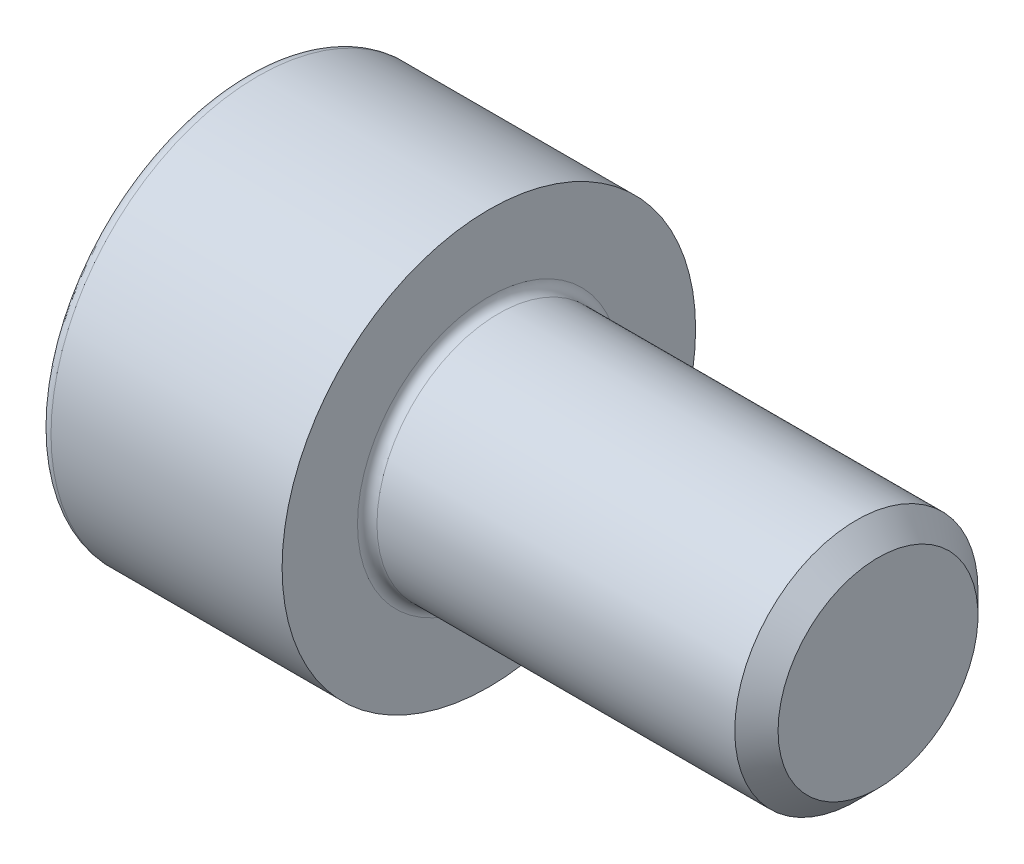
ISO-10303-21;
HEADER;
FILE_DESCRIPTION(('STEP AP214'),'2;1');
FILE_NAME('part.step','',(''),(''),'','','');
FILE_SCHEMA(('AUTOMOTIVE_DESIGN { 1 0 10303 214 1 1 1 1 }'));
ENDSEC;
DATA;
#1=APPLICATION_CONTEXT('core data for automotive mechanical design processes');
#2=APPLICATION_PROTOCOL_DEFINITION('international standard','automotive_design',2000,#1);
#3=PRODUCT_CONTEXT('',#1,'mechanical');
#4=PRODUCT('Part','Part','',(#3));
#5=PRODUCT_RELATED_PRODUCT_CATEGORY('part','',(#4));
#6=PRODUCT_DEFINITION_FORMATION('','',#4);
#7=PRODUCT_DEFINITION_CONTEXT('part definition',#1,'design');
#8=PRODUCT_DEFINITION('design','',#6,#7);
#9=PRODUCT_DEFINITION_SHAPE('','',#8);
#10=(LENGTH_UNIT() NAMED_UNIT(*) SI_UNIT(.MILLI.,.METRE.));
#11=(NAMED_UNIT(*) PLANE_ANGLE_UNIT() SI_UNIT($,.RADIAN.));
#12=(NAMED_UNIT(*) SI_UNIT($,.STERADIAN.) SOLID_ANGLE_UNIT());
#13=UNCERTAINTY_MEASURE_WITH_UNIT(LENGTH_MEASURE(1.E-05),#10,'distance_accuracy_value','');
#14=(GEOMETRIC_REPRESENTATION_CONTEXT(3) GLOBAL_UNCERTAINTY_ASSIGNED_CONTEXT((#13)) GLOBAL_UNIT_ASSIGNED_CONTEXT((#10,
#11,#12)) REPRESENTATION_CONTEXT('',''));
#15=CARTESIAN_POINT('',(0.,0.,0.));
#16=DIRECTION('',(0.,0.,1.));
#17=DIRECTION('',(1.,0.,0.));
#18=AXIS2_PLACEMENT_3D('',#15,#16,#17);
#19=CARTESIAN_POINT('',(2.5,2.3094010767585,0.));
#20=DIRECTION('',(1.,0.,0.));
#21=DIRECTION('',(0.,0.,-1.));
#22=AXIS2_PLACEMENT_3D('',#19,#20,#21);
#23=PLANE('',#22);
#24=CARTESIAN_POINT('',(2.5,0.,0.));
#25=DIRECTION('',(1.,0.,0.));
#26=DIRECTION('',(0.,0.,-1.));
#27=AXIS2_PLACEMENT_3D('',#24,#25,#26);
#28=CIRCLE('',#27,2.);
#29=CARTESIAN_POINT('',(2.5,0.,-2.));
#30=VERTEX_POINT('',#29);
#31=CARTESIAN_POINT('',(2.5,-1.73205080756888,-0.999999999999999));
#32=VERTEX_POINT('',#31);
#33=EDGE_CURVE('E11',#30,#32,#28,.F.);
#34=ORIENTED_EDGE('',*,*,#33,.F.);
#35=DIRECTION('',(0.,1.,0.));
#36=VECTOR('',#35,1.);
#37=CARTESIAN_POINT('',(2.5,-1.15470053837925,-2.));
#38=LINE('',#37,#36);
#39=CARTESIAN_POINT('',(2.5,-1.15470053837925,-2.));
#40=VERTEX_POINT('',#39);
#41=EDGE_CURVE('E177',#40,#30,#38,.T.);
#42=ORIENTED_EDGE('',*,*,#41,.F.);
#43=DIRECTION('',(0.,0.5,-0.866025403784439));
#44=VECTOR('',#43,1.);
#45=CARTESIAN_POINT('',(2.5,-2.3094010767585,0.));
#46=LINE('',#45,#44);
#47=EDGE_CURVE('E173',#32,#40,#46,.T.);
#48=ORIENTED_EDGE('',*,*,#47,.F.);
#49=EDGE_LOOP('',(#34,#42,#48));
#50=FACE_BOUND('',#49,.T.);
#51=ADVANCED_FACE('F33',(#50),#23,.F.);
#52=CARTESIAN_POINT('',(2.5,-1.73205080756888,1.));
#53=VERTEX_POINT('',#52);
#54=EDGE_CURVE('E42',#32,#53,#28,.F.);
#55=ORIENTED_EDGE('',*,*,#54,.F.);
#56=CARTESIAN_POINT('',(2.5,-2.3094010767585,0.));
#57=VERTEX_POINT('',#56);
#58=EDGE_CURVE('E174',#57,#32,#46,.T.);
#59=ORIENTED_EDGE('',*,*,#58,.F.);
#60=DIRECTION('',(0.,-0.5,-0.866025403784439));
#61=VECTOR('',#60,1.);
#62=CARTESIAN_POINT('',(2.5,-1.15470053837925,2.));
#63=LINE('',#62,#61);
#64=EDGE_CURVE('E169',#53,#57,#63,.T.);
#65=ORIENTED_EDGE('',*,*,#64,.F.);
#66=EDGE_LOOP('',(#55,#59,#65));
#67=FACE_BOUND('',#66,.T.);
#68=ADVANCED_FACE('F117',(#67),#23,.F.);
#69=CARTESIAN_POINT('',(2.5,0.,2.));
#70=VERTEX_POINT('',#69);
#71=EDGE_CURVE('E253',#53,#70,#28,.F.);
#72=ORIENTED_EDGE('',*,*,#71,.F.);
#73=CARTESIAN_POINT('',(2.5,-1.15470053837925,2.));
#74=VERTEX_POINT('',#73);
#75=EDGE_CURVE('E170',#74,#53,#63,.T.);
#76=ORIENTED_EDGE('',*,*,#75,.F.);
#77=DIRECTION('',(0.,-1.,0.));
#78=VECTOR('',#77,1.);
#79=CARTESIAN_POINT('',(2.5,1.15470053837925,2.));
#80=LINE('',#79,#78);
#81=EDGE_CURVE('E165',#70,#74,#80,.T.);
#82=ORIENTED_EDGE('',*,*,#81,.F.);
#83=EDGE_LOOP('',(#72,#76,#82));
#84=FACE_BOUND('',#83,.T.);
#85=ADVANCED_FACE('F123',(#84),#23,.F.);
#86=CARTESIAN_POINT('',(2.5,0.,0.));
#87=DIRECTION('',(-1.,0.,0.));
#88=DIRECTION('',(0.,0.,1.));
#89=AXIS2_PLACEMENT_3D('',#86,#87,#88);
#90=CIRCLE('',#89,2.);
#91=CARTESIAN_POINT('',(2.5,1.73205080756888,0.999999999999999));
#92=VERTEX_POINT('',#91);
#93=EDGE_CURVE('E163',#70,#92,#90,.T.);
#94=ORIENTED_EDGE('',*,*,#93,.F.);
#95=CARTESIAN_POINT('',(2.5,1.15470053837925,2.));
#96=VERTEX_POINT('',#95);
#97=EDGE_CURVE('E166',#96,#70,#80,.T.);
#98=ORIENTED_EDGE('',*,*,#97,.F.);
#99=DIRECTION('',(0.,-0.5,0.866025403784439));
#100=VECTOR('',#99,1.);
#101=CARTESIAN_POINT('',(2.5,2.3094010767585,0.));
#102=LINE('',#101,#100);
#103=EDGE_CURVE('E160',#92,#96,#102,.T.);
#104=ORIENTED_EDGE('',*,*,#103,.F.);
#105=EDGE_LOOP('',(#94,#98,#104));
#106=FACE_BOUND('',#105,.T.);
#107=ADVANCED_FACE('F137',(#106),#23,.F.);
#108=CARTESIAN_POINT('',(2.5,1.73205080756888,-1.));
#109=VERTEX_POINT('',#108);
#110=EDGE_CURVE('E49',#92,#109,#28,.F.);
#111=ORIENTED_EDGE('',*,*,#110,.F.);
#112=CARTESIAN_POINT('',(2.5,2.3094010767585,0.));
#113=VERTEX_POINT('',#112);
#114=EDGE_CURVE('E151',#113,#92,#102,.T.);
#115=ORIENTED_EDGE('',*,*,#114,.F.);
#116=DIRECTION('',(0.,0.5,0.866025403784439));
#117=VECTOR('',#116,1.);
#118=CARTESIAN_POINT('',(2.5,1.15470053837925,-2.));
#119=LINE('',#118,#117);
#120=EDGE_CURVE('E148',#109,#113,#119,.T.);
#121=ORIENTED_EDGE('',*,*,#120,.F.);
#122=EDGE_LOOP('',(#111,#115,#121));
#123=FACE_BOUND('',#122,.T.);
#124=ADVANCED_FACE('F128',(#123),#23,.F.);
#125=EDGE_CURVE('E37',#109,#30,#28,.F.);
#126=ORIENTED_EDGE('',*,*,#125,.F.);
#127=CARTESIAN_POINT('',(2.5,1.15470053837925,-2.));
#128=VERTEX_POINT('',#127);
#129=EDGE_CURVE('E143',#128,#109,#119,.T.);
#130=ORIENTED_EDGE('',*,*,#129,.F.);
#131=EDGE_CURVE('E144',#30,#128,#38,.T.);
#132=ORIENTED_EDGE('',*,*,#131,.F.);
#133=EDGE_LOOP('',(#126,#130,#132));
#134=FACE_BOUND('',#133,.T.);
#135=ADVANCED_FACE('F119',(#134),#23,.F.);
#136=CARTESIAN_POINT('',(0.,0.,0.));
#137=DIRECTION('',(1.,0.,0.));
#138=DIRECTION('',(0.,0.,-1.));
#139=AXIS2_PLACEMENT_3D('',#136,#137,#138);
#140=PLANE('',#139);
#141=CARTESIAN_POINT('',(0.,0.,0.));
#142=DIRECTION('',(1.,0.,0.));
#143=DIRECTION('',(0.,0.,-1.));
#144=AXIS2_PLACEMENT_3D('',#141,#142,#143);
#145=CIRCLE('',#144,4.);
#146=CARTESIAN_POINT('',(0.,0.,-4.));
#147=VERTEX_POINT('',#146);
#148=EDGE_CURVE('E220',#147,#147,#145,.F.);
#149=ORIENTED_EDGE('',*,*,#148,.T.);
#150=EDGE_LOOP('',(#149));
#151=FACE_BOUND('',#150,.T.);
#152=DIRECTION('',(0.,0.5,0.866025403784439));
#153=VECTOR('',#152,1.);
#154=CARTESIAN_POINT('',(0.,1.15470053837925,-2.));
#155=LINE('',#154,#153);
#156=CARTESIAN_POINT('',(0.,1.15470053837925,-2.));
#157=VERTEX_POINT('',#156);
#158=CARTESIAN_POINT('',(0.,2.3094010767585,0.));
#159=VERTEX_POINT('',#158);
#160=EDGE_CURVE('E179',#157,#159,#155,.T.);
#161=ORIENTED_EDGE('',*,*,#160,.T.);
#162=DIRECTION('',(0.,-0.5,0.866025403784439));
#163=VECTOR('',#162,1.);
#164=CARTESIAN_POINT('',(0.,2.3094010767585,0.));
#165=LINE('',#164,#163);
#166=CARTESIAN_POINT('',(0.,1.15470053837925,2.));
#167=VERTEX_POINT('',#166);
#168=EDGE_CURVE('E181',#159,#167,#165,.T.);
#169=ORIENTED_EDGE('',*,*,#168,.T.);
#170=DIRECTION('',(0.,-1.,0.));
#171=VECTOR('',#170,1.);
#172=CARTESIAN_POINT('',(0.,1.15470053837925,2.));
#173=LINE('',#172,#171);
#174=CARTESIAN_POINT('',(0.,-1.15470053837925,2.));
#175=VERTEX_POINT('',#174);
#176=EDGE_CURVE('E183',#167,#175,#173,.T.);
#177=ORIENTED_EDGE('',*,*,#176,.T.);
#178=DIRECTION('',(0.,-0.5,-0.866025403784439));
#179=VECTOR('',#178,1.);
#180=CARTESIAN_POINT('',(0.,-1.15470053837925,2.));
#181=LINE('',#180,#179);
#182=CARTESIAN_POINT('',(0.,-2.3094010767585,0.));
#183=VERTEX_POINT('',#182);
#184=EDGE_CURVE('E185',#175,#183,#181,.T.);
#185=ORIENTED_EDGE('',*,*,#184,.T.);
#186=DIRECTION('',(0.,0.5,-0.866025403784439));
#187=VECTOR('',#186,1.);
#188=CARTESIAN_POINT('',(0.,-2.3094010767585,0.));
#189=LINE('',#188,#187);
#190=CARTESIAN_POINT('',(0.,-1.15470053837925,-2.));
#191=VERTEX_POINT('',#190);
#192=EDGE_CURVE('E187',#183,#191,#189,.T.);
#193=ORIENTED_EDGE('',*,*,#192,.T.);
#194=DIRECTION('',(0.,1.,0.));
#195=VECTOR('',#194,1.);
#196=CARTESIAN_POINT('',(0.,-1.15470053837925,-2.));
#197=LINE('',#196,#195);
#198=EDGE_CURVE('E57',#191,#157,#197,.T.);
#199=ORIENTED_EDGE('',*,*,#198,.T.);
#200=EDGE_LOOP('',(#161,#169,#177,#185,#193,#199));
#201=FACE_BOUND('',#200,.T.);
#202=ADVANCED_FACE('F127',(#151,#201),#140,.F.);
#203=CARTESIAN_POINT('',(0.,0.,0.));
#204=DIRECTION('',(-1.,0.,0.));
#205=DIRECTION('',(0.,0.,1.));
#206=AXIS2_PLACEMENT_3D('',#203,#204,#205);
#207=CYLINDRICAL_SURFACE('',#206,4.25);
#208=CARTESIAN_POINT('',(0.25,0.,0.));
#209=DIRECTION('',(1.,0.,0.));
#210=DIRECTION('',(0.,0.,-1.));
#211=AXIS2_PLACEMENT_3D('',#208,#209,#210);
#212=CIRCLE('',#211,4.25);
#213=CARTESIAN_POINT('',(0.25,0.,-4.25));
#214=VERTEX_POINT('',#213);
#215=EDGE_CURVE('E146',#214,#214,#212,.T.);
#216=ORIENTED_EDGE('',*,*,#215,.T.);
#217=EDGE_LOOP('',(#216));
#218=FACE_BOUND('',#217,.T.);
#219=CARTESIAN_POINT('',(5.,0.,0.));
#220=DIRECTION('',(-1.,0.,0.));
#221=DIRECTION('',(0.,0.,1.));
#222=AXIS2_PLACEMENT_3D('',#219,#220,#221);
#223=CIRCLE('',#222,4.25);
#224=CARTESIAN_POINT('',(5.,0.,4.25));
#225=VERTEX_POINT('',#224);
#226=EDGE_CURVE('E211',#225,#225,#223,.T.);
#227=ORIENTED_EDGE('',*,*,#226,.T.);
#228=EDGE_LOOP('',(#227));
#229=FACE_BOUND('',#228,.T.);
#230=ADVANCED_FACE('F134',(#218,#229),#207,.T.);
#231=CARTESIAN_POINT('',(5.,4.25,0.));
#232=DIRECTION('',(-1.,0.,0.));
#233=DIRECTION('',(0.,0.,1.));
#234=AXIS2_PLACEMENT_3D('',#231,#232,#233);
#235=PLANE('',#234);
#236=CARTESIAN_POINT('',(5.,0.,0.));
#237=DIRECTION('',(-1.,0.,0.));
#238=DIRECTION('',(0.,0.,1.));
#239=AXIS2_PLACEMENT_3D('',#236,#237,#238);
#240=CIRCLE('',#239,2.7);
#241=CARTESIAN_POINT('',(5.,0.,2.7));
#242=VERTEX_POINT('',#241);
#243=EDGE_CURVE('E214',#242,#242,#240,.T.);
#244=ORIENTED_EDGE('',*,*,#243,.T.);
#245=EDGE_LOOP('',(#244));
#246=FACE_BOUND('',#245,.T.);
#247=ORIENTED_EDGE('',*,*,#226,.F.);
#248=EDGE_LOOP('',(#247));
#249=FACE_BOUND('',#248,.T.);
#250=ADVANCED_FACE('F362',(#246,#249),#235,.F.);
#251=CARTESIAN_POINT('',(0.,0.,0.));
#252=DIRECTION('',(-1.,0.,0.));
#253=DIRECTION('',(0.,0.,1.));
#254=AXIS2_PLACEMENT_3D('',#251,#252,#253);
#255=CYLINDRICAL_SURFACE('',#254,2.5);
#256=CARTESIAN_POINT('',(5.2,0.,0.));
#257=DIRECTION('',(-1.,0.,0.));
#258=DIRECTION('',(0.,0.,1.));
#259=AXIS2_PLACEMENT_3D('',#256,#257,#258);
#260=CIRCLE('',#259,2.5);
#261=CARTESIAN_POINT('',(5.2,0.,2.5));
#262=VERTEX_POINT('',#261);
#263=EDGE_CURVE('E217',#262,#262,#260,.F.);
#264=ORIENTED_EDGE('',*,*,#263,.T.);
#265=EDGE_LOOP('',(#264));
#266=FACE_BOUND('',#265,.T.);
#267=CARTESIAN_POINT('',(12.555,0.,0.));
#268=DIRECTION('',(-1.,0.,0.));
#269=DIRECTION('',(0.,0.,1.));
#270=AXIS2_PLACEMENT_3D('',#267,#268,#269);
#271=CIRCLE('',#270,2.5);
#272=CARTESIAN_POINT('',(12.555,0.,2.5));
#273=VERTEX_POINT('',#272);
#274=EDGE_CURVE('E208',#273,#273,#271,.T.);
#275=ORIENTED_EDGE('',*,*,#274,.T.);
#276=EDGE_LOOP('',(#275));
#277=FACE_BOUND('',#276,.T.);
#278=ADVANCED_FACE('F378',(#266,#277),#255,.T.);
#279=CARTESIAN_POINT('',(13.,0.,0.));
#280=DIRECTION('',(-1.,0.,0.));
#281=DIRECTION('',(0.,0.,1.));
#282=AXIS2_PLACEMENT_3D('',#279,#280,#281);
#283=CONICAL_SURFACE('',#282,2.055,0.785398163397451);
#284=ORIENTED_EDGE('',*,*,#274,.F.);
#285=EDGE_LOOP('',(#284));
#286=FACE_BOUND('',#285,.T.);
#287=CARTESIAN_POINT('',(13.,0.,0.));
#288=DIRECTION('',(-1.,0.,0.));
#289=DIRECTION('',(0.,0.,1.));
#290=AXIS2_PLACEMENT_3D('',#287,#288,#289);
#291=CIRCLE('',#290,2.055);
#292=CARTESIAN_POINT('',(13.,0.,2.055));
#293=VERTEX_POINT('',#292);
#294=EDGE_CURVE('E205',#293,#293,#291,.T.);
#295=ORIENTED_EDGE('',*,*,#294,.T.);
#296=EDGE_LOOP('',(#295));
#297=FACE_BOUND('',#296,.T.);
#298=ADVANCED_FACE('F383',(#286,#297),#283,.T.);
#299=CARTESIAN_POINT('',(13.,2.055,0.));
#300=DIRECTION('',(-1.,0.,0.));
#301=DIRECTION('',(0.,0.,1.));
#302=AXIS2_PLACEMENT_3D('',#299,#300,#301);
#303=PLANE('',#302);
#304=ORIENTED_EDGE('',*,*,#294,.F.);
#305=EDGE_LOOP('',(#304));
#306=FACE_BOUND('',#305,.T.);
#307=ADVANCED_FACE('F371',(#306),#303,.F.);
#308=CARTESIAN_POINT('',(5.2,0.,0.));
#309=DIRECTION('',(-1.,0.,0.));
#310=DIRECTION('',(0.,0.,1.));
#311=AXIS2_PLACEMENT_3D('',#308,#309,#310);
#312=TOROIDAL_SURFACE('',#311,2.7,0.2);
#313=ORIENTED_EDGE('',*,*,#263,.F.);
#314=EDGE_LOOP('',(#313));
#315=FACE_BOUND('',#314,.T.);
#316=ORIENTED_EDGE('',*,*,#243,.F.);
#317=EDGE_LOOP('',(#316));
#318=FACE_BOUND('',#317,.T.);
#319=ADVANCED_FACE('F229',(#315,#318),#312,.F.);
#320=CARTESIAN_POINT('',(0.25,0.,0.));
#321=DIRECTION('',(1.,0.,0.));
#322=DIRECTION('',(0.,0.,-1.));
#323=AXIS2_PLACEMENT_3D('',#320,#321,#322);
#324=TOROIDAL_SURFACE('',#323,4.,0.25);
#325=ORIENTED_EDGE('',*,*,#215,.F.);
#326=EDGE_LOOP('',(#325));
#327=FACE_BOUND('',#326,.T.);
#328=ORIENTED_EDGE('',*,*,#148,.F.);
#329=EDGE_LOOP('',(#328));
#330=FACE_BOUND('',#329,.T.);
#331=ADVANCED_FACE('F35',(#327,#330),#324,.T.);
#332=CARTESIAN_POINT('',(2.5,1.15470053837925,-2.));
#333=DIRECTION('',(0.,-0.866025403784439,0.5));
#334=DIRECTION('',(0.,-0.5,-0.866025403784439));
#335=AXIS2_PLACEMENT_3D('',#332,#333,#334);
#336=PLANE('',#335);
#337=ORIENTED_EDGE('',*,*,#129,.T.);
#338=ORIENTED_EDGE('',*,*,#120,.T.);
#339=DIRECTION('',(-1.,0.,0.));
#340=VECTOR('',#339,1.);
#341=CARTESIAN_POINT('',(2.5,2.3094010767585,0.));
#342=LINE('',#341,#340);
#343=EDGE_CURVE('E203',#113,#159,#342,.T.);
#344=ORIENTED_EDGE('',*,*,#343,.T.);
#345=ORIENTED_EDGE('',*,*,#160,.F.);
#346=DIRECTION('',(-1.,0.,0.));
#347=VECTOR('',#346,1.);
#348=CARTESIAN_POINT('',(2.5,1.15470053837925,-2.));
#349=LINE('',#348,#347);
#350=EDGE_CURVE('E159',#128,#157,#349,.T.);
#351=ORIENTED_EDGE('',*,*,#350,.F.);
#352=EDGE_LOOP('',(#337,#338,#344,#345,#351));
#353=FACE_BOUND('',#352,.T.);
#354=ADVANCED_FACE('F157',(#353),#336,.T.);
#355=CARTESIAN_POINT('',(2.5,2.3094010767585,0.));
#356=DIRECTION('',(0.,-0.866025403784439,-0.5));
#357=DIRECTION('',(0.,0.5,-0.866025403784439));
#358=AXIS2_PLACEMENT_3D('',#355,#356,#357);
#359=PLANE('',#358);
#360=ORIENTED_EDGE('',*,*,#114,.T.);
#361=ORIENTED_EDGE('',*,*,#103,.T.);
#362=DIRECTION('',(-1.,0.,0.));
#363=VECTOR('',#362,1.);
#364=CARTESIAN_POINT('',(2.5,1.15470053837925,2.));
#365=LINE('',#364,#363);
#366=EDGE_CURVE('E200',#96,#167,#365,.T.);
#367=ORIENTED_EDGE('',*,*,#366,.T.);
#368=ORIENTED_EDGE('',*,*,#168,.F.);
#369=ORIENTED_EDGE('',*,*,#343,.F.);
#370=EDGE_LOOP('',(#360,#361,#367,#368,#369));
#371=FACE_BOUND('',#370,.T.);
#372=ADVANCED_FACE('F233',(#371),#359,.T.);
#373=CARTESIAN_POINT('',(2.5,1.15470053837925,2.));
#374=DIRECTION('',(0.,0.,-1.));
#375=DIRECTION('',(-1.,0.,0.));
#376=AXIS2_PLACEMENT_3D('',#373,#374,#375);
#377=PLANE('',#376);
#378=ORIENTED_EDGE('',*,*,#97,.T.);
#379=ORIENTED_EDGE('',*,*,#81,.T.);
#380=DIRECTION('',(-1.,0.,0.));
#381=VECTOR('',#380,1.);
#382=CARTESIAN_POINT('',(2.5,-1.15470053837925,2.));
#383=LINE('',#382,#381);
#384=EDGE_CURVE('E197',#74,#175,#383,.T.);
#385=ORIENTED_EDGE('',*,*,#384,.T.);
#386=ORIENTED_EDGE('',*,*,#176,.F.);
#387=ORIENTED_EDGE('',*,*,#366,.F.);
#388=EDGE_LOOP('',(#378,#379,#385,#386,#387));
#389=FACE_BOUND('',#388,.T.);
#390=ADVANCED_FACE('F238',(#389),#377,.T.);
#391=CARTESIAN_POINT('',(2.5,-1.15470053837925,2.));
#392=DIRECTION('',(0.,0.866025403784439,-0.5));
#393=DIRECTION('',(0.,0.5,0.866025403784439));
#394=AXIS2_PLACEMENT_3D('',#391,#392,#393);
#395=PLANE('',#394);
#396=ORIENTED_EDGE('',*,*,#75,.T.);
#397=ORIENTED_EDGE('',*,*,#64,.T.);
#398=DIRECTION('',(-1.,0.,0.));
#399=VECTOR('',#398,1.);
#400=CARTESIAN_POINT('',(2.5,-2.3094010767585,0.));
#401=LINE('',#400,#399);
#402=EDGE_CURVE('E194',#57,#183,#401,.T.);
#403=ORIENTED_EDGE('',*,*,#402,.T.);
#404=ORIENTED_EDGE('',*,*,#184,.F.);
#405=ORIENTED_EDGE('',*,*,#384,.F.);
#406=EDGE_LOOP('',(#396,#397,#403,#404,#405));
#407=FACE_BOUND('',#406,.T.);
#408=ADVANCED_FACE('F244',(#407),#395,.T.);
#409=CARTESIAN_POINT('',(2.5,-2.3094010767585,0.));
#410=DIRECTION('',(0.,0.866025403784439,0.5));
#411=DIRECTION('',(0.,-0.5,0.866025403784439));
#412=AXIS2_PLACEMENT_3D('',#409,#410,#411);
#413=PLANE('',#412);
#414=ORIENTED_EDGE('',*,*,#58,.T.);
#415=ORIENTED_EDGE('',*,*,#47,.T.);
#416=DIRECTION('',(-1.,0.,0.));
#417=VECTOR('',#416,1.);
#418=CARTESIAN_POINT('',(2.5,-1.15470053837925,-2.));
#419=LINE('',#418,#417);
#420=EDGE_CURVE('E191',#40,#191,#419,.T.);
#421=ORIENTED_EDGE('',*,*,#420,.T.);
#422=ORIENTED_EDGE('',*,*,#192,.F.);
#423=ORIENTED_EDGE('',*,*,#402,.F.);
#424=EDGE_LOOP('',(#414,#415,#421,#422,#423));
#425=FACE_BOUND('',#424,.T.);
#426=ADVANCED_FACE('F112',(#425),#413,.T.);
#427=CARTESIAN_POINT('',(2.5,-1.15470053837925,-2.));
#428=DIRECTION('',(0.,0.,1.));
#429=DIRECTION('',(1.,0.,0.));
#430=AXIS2_PLACEMENT_3D('',#427,#428,#429);
#431=PLANE('',#430);
#432=ORIENTED_EDGE('',*,*,#41,.T.);
#433=ORIENTED_EDGE('',*,*,#131,.T.);
#434=ORIENTED_EDGE('',*,*,#350,.T.);
#435=ORIENTED_EDGE('',*,*,#198,.F.);
#436=ORIENTED_EDGE('',*,*,#420,.F.);
#437=EDGE_LOOP('',(#432,#433,#434,#435,#436));
#438=FACE_BOUND('',#437,.T.);
#439=ADVANCED_FACE('F107',(#438),#431,.T.);
#440=CARTESIAN_POINT('',(3.65470053837926,0.,0.));
#441=DIRECTION('',(-1.,0.,0.));
#442=DIRECTION('',(0.,0.,1.));
#443=AXIS2_PLACEMENT_3D('',#440,#441,#442);
#444=CONICAL_SURFACE('',#443,0.,1.04719755119659);
#445=ORIENTED_EDGE('',*,*,#93,.T.);
#446=ORIENTED_EDGE('',*,*,#110,.T.);
#447=ORIENTED_EDGE('',*,*,#125,.T.);
#448=ORIENTED_EDGE('',*,*,#33,.T.);
#449=ORIENTED_EDGE('',*,*,#54,.T.);
#450=ORIENTED_EDGE('',*,*,#71,.T.);
#451=EDGE_LOOP('',(#445,#446,#447,#448,#449,#450));
#452=FACE_BOUND('',#451,.T.);
#453=CARTESIAN_POINT('',(3.65470053837926,0.,0.));
#454=VERTEX_POINT('',#453);
#455=VERTEX_LOOP('',#454);
#456=FACE_BOUND('',#455,.T.);
#457=ADVANCED_FACE('F105',(#452,#456),#444,.F.);
#458=CLOSED_SHELL('',(#51,#68,#85,#107,#124,#135,#202,#230,#250,#278,#298,#307,#319,#331,#354,
#372,#390,#408,#426,#439,#457));
#459=MANIFOLD_SOLID_BREP('B2',#458);
#460=ADVANCED_BREP_SHAPE_REPRESENTATION('',(#18,#459),#14);
#461=SHAPE_DEFINITION_REPRESENTATION(#9,#460);
ENDSEC;
END-ISO-10303-21;
